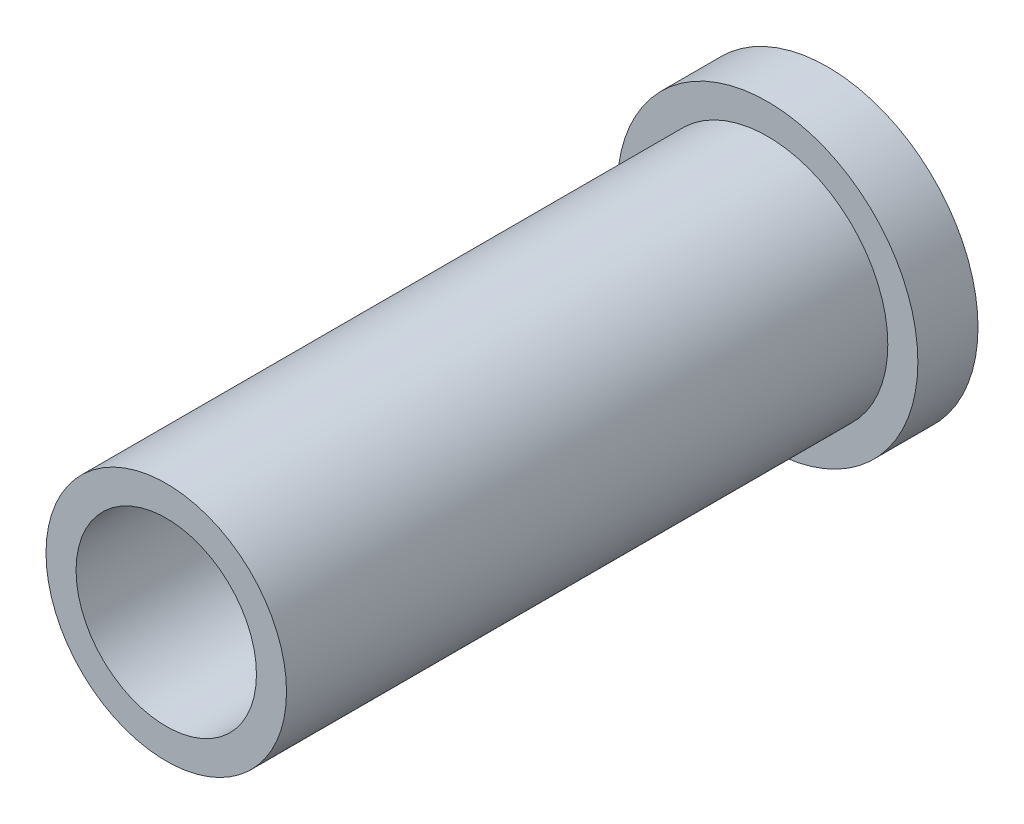
ISO-10303-21;
HEADER;
FILE_DESCRIPTION(('STEP AP214'),'2;1');
FILE_NAME('part.step','',(''),(''),'','','');
FILE_SCHEMA(('AUTOMOTIVE_DESIGN { 1 0 10303 214 1 1 1 1 }'));
ENDSEC;
DATA;
#1=APPLICATION_CONTEXT('core data for automotive mechanical design processes');
#2=APPLICATION_PROTOCOL_DEFINITION('international standard','automotive_design',2000,#1);
#3=PRODUCT_CONTEXT('',#1,'mechanical');
#4=PRODUCT('Part','Part','',(#3));
#5=PRODUCT_RELATED_PRODUCT_CATEGORY('part','',(#4));
#6=PRODUCT_DEFINITION_FORMATION('','',#4);
#7=PRODUCT_DEFINITION_CONTEXT('part definition',#1,'design');
#8=PRODUCT_DEFINITION('design','',#6,#7);
#9=PRODUCT_DEFINITION_SHAPE('','',#8);
#10=(LENGTH_UNIT() NAMED_UNIT(*) SI_UNIT(.MILLI.,.METRE.));
#11=(NAMED_UNIT(*) PLANE_ANGLE_UNIT() SI_UNIT($,.RADIAN.));
#12=(NAMED_UNIT(*) SI_UNIT($,.STERADIAN.) SOLID_ANGLE_UNIT());
#13=UNCERTAINTY_MEASURE_WITH_UNIT(LENGTH_MEASURE(1.E-05),#10,'distance_accuracy_value','');
#14=(GEOMETRIC_REPRESENTATION_CONTEXT(3) GLOBAL_UNCERTAINTY_ASSIGNED_CONTEXT((#13)) GLOBAL_UNIT_ASSIGNED_CONTEXT((#10,
#11,#12)) REPRESENTATION_CONTEXT('',''));
#15=CARTESIAN_POINT('',(0.,0.,0.));
#16=DIRECTION('',(0.,0.,1.));
#17=DIRECTION('',(1.,0.,0.));
#18=AXIS2_PLACEMENT_3D('',#15,#16,#17);
#19=CARTESIAN_POINT('',(0.,0.,3.));
#20=DIRECTION('',(0.,0.,-1.));
#21=DIRECTION('',(-1.,0.,0.));
#22=AXIS2_PLACEMENT_3D('',#19,#20,#21);
#23=CYLINDRICAL_SURFACE('',#22,7.5);
#24=CARTESIAN_POINT('',(0.,0.,3.));
#25=DIRECTION('',(0.,0.,1.));
#26=DIRECTION('',(1.,0.,0.));
#27=AXIS2_PLACEMENT_3D('',#24,#25,#26);
#28=CIRCLE('',#27,7.5);
#29=CARTESIAN_POINT('',(7.5,0.,3.));
#30=VERTEX_POINT('',#29);
#31=EDGE_CURVE('E37',#30,#30,#28,.T.);
#32=ORIENTED_EDGE('',*,*,#31,.F.);
#33=EDGE_LOOP('',(#32));
#34=FACE_BOUND('',#33,.T.);
#35=CARTESIAN_POINT('',(0.,0.,0.));
#36=DIRECTION('',(0.,0.,1.));
#37=DIRECTION('',(1.,0.,0.));
#38=AXIS2_PLACEMENT_3D('',#35,#36,#37);
#39=CIRCLE('',#38,7.5);
#40=CARTESIAN_POINT('',(7.5,0.,0.));
#41=VERTEX_POINT('',#40);
#42=EDGE_CURVE('E41',#41,#41,#39,.T.);
#43=ORIENTED_EDGE('',*,*,#42,.T.);
#44=EDGE_LOOP('',(#43));
#45=FACE_BOUND('',#44,.T.);
#46=ADVANCED_FACE('F31',(#34,#45),#23,.T.);
#47=CARTESIAN_POINT('',(0.,0.,3.));
#48=DIRECTION('',(0.,0.,1.));
#49=DIRECTION('',(1.,0.,0.));
#50=AXIS2_PLACEMENT_3D('',#47,#48,#49);
#51=PLANE('',#50);
#52=CARTESIAN_POINT('',(0.,0.,3.));
#53=DIRECTION('',(0.,0.,1.));
#54=DIRECTION('',(1.,0.,0.));
#55=AXIS2_PLACEMENT_3D('',#52,#53,#54);
#56=CIRCLE('',#55,6.);
#57=CARTESIAN_POINT('',(6.,0.,3.));
#58=VERTEX_POINT('',#57);
#59=EDGE_CURVE('E48',#58,#58,#56,.T.);
#60=ORIENTED_EDGE('',*,*,#59,.F.);
#61=EDGE_LOOP('',(#60));
#62=FACE_BOUND('',#61,.T.);
#63=ORIENTED_EDGE('',*,*,#31,.T.);
#64=EDGE_LOOP('',(#63));
#65=FACE_BOUND('',#64,.T.);
#66=ADVANCED_FACE('F71',(#62,#65),#51,.T.);
#67=CARTESIAN_POINT('',(0.,0.,0.));
#68=DIRECTION('',(0.,0.,1.));
#69=DIRECTION('',(1.,0.,0.));
#70=AXIS2_PLACEMENT_3D('',#67,#68,#69);
#71=PLANE('',#70);
#72=ORIENTED_EDGE('',*,*,#42,.F.);
#73=EDGE_LOOP('',(#72));
#74=FACE_BOUND('',#73,.T.);
#75=ADVANCED_FACE('F62',(#74),#71,.F.);
#76=CARTESIAN_POINT('',(0.,0.,33.));
#77=DIRECTION('',(0.,0.,1.));
#78=DIRECTION('',(1.,0.,0.));
#79=AXIS2_PLACEMENT_3D('',#76,#77,#78);
#80=PLANE('',#79);
#81=CARTESIAN_POINT('',(0.,0.,33.));
#82=DIRECTION('',(0.,0.,1.));
#83=DIRECTION('',(1.,0.,0.));
#84=AXIS2_PLACEMENT_3D('',#81,#82,#83);
#85=CIRCLE('',#84,6.);
#86=CARTESIAN_POINT('',(6.,0.,33.));
#87=VERTEX_POINT('',#86);
#88=EDGE_CURVE('E46',#87,#87,#85,.T.);
#89=ORIENTED_EDGE('',*,*,#88,.T.);
#90=EDGE_LOOP('',(#89));
#91=FACE_BOUND('',#90,.T.);
#92=CARTESIAN_POINT('',(0.,0.,33.));
#93=DIRECTION('',(0.,0.,1.));
#94=DIRECTION('',(1.,0.,0.));
#95=AXIS2_PLACEMENT_3D('',#92,#93,#94);
#96=CIRCLE('',#95,4.5);
#97=CARTESIAN_POINT('',(4.5,0.,33.));
#98=VERTEX_POINT('',#97);
#99=EDGE_CURVE('E51',#98,#98,#96,.T.);
#100=ORIENTED_EDGE('',*,*,#99,.F.);
#101=EDGE_LOOP('',(#100));
#102=FACE_BOUND('',#101,.T.);
#103=ADVANCED_FACE('F59',(#91,#102),#80,.T.);
#104=CARTESIAN_POINT('',(0.,0.,33.));
#105=DIRECTION('',(0.,0.,-1.));
#106=DIRECTION('',(-1.,0.,0.));
#107=AXIS2_PLACEMENT_3D('',#104,#105,#106);
#108=CYLINDRICAL_SURFACE('',#107,6.);
#109=ORIENTED_EDGE('',*,*,#88,.F.);
#110=EDGE_LOOP('',(#109));
#111=FACE_BOUND('',#110,.T.);
#112=ORIENTED_EDGE('',*,*,#59,.T.);
#113=EDGE_LOOP('',(#112));
#114=FACE_BOUND('',#113,.T.);
#115=ADVANCED_FACE('F61',(#111,#114),#108,.T.);
#116=CARTESIAN_POINT('',(0.,0.,33.));
#117=DIRECTION('',(0.,0.,-1.));
#118=DIRECTION('',(-1.,0.,0.));
#119=AXIS2_PLACEMENT_3D('',#116,#117,#118);
#120=CYLINDRICAL_SURFACE('',#119,4.5);
#121=ORIENTED_EDGE('',*,*,#99,.T.);
#122=EDGE_LOOP('',(#121));
#123=FACE_BOUND('',#122,.T.);
#124=CARTESIAN_POINT('',(0.,0.,3.));
#125=DIRECTION('',(0.,0.,1.));
#126=DIRECTION('',(1.,0.,0.));
#127=AXIS2_PLACEMENT_3D('',#124,#125,#126);
#128=CIRCLE('',#127,4.5);
#129=CARTESIAN_POINT('',(4.5,0.,3.));
#130=VERTEX_POINT('',#129);
#131=EDGE_CURVE('E10',#130,#130,#128,.F.);
#132=ORIENTED_EDGE('',*,*,#131,.T.);
#133=EDGE_LOOP('',(#132));
#134=FACE_BOUND('',#133,.T.);
#135=ADVANCED_FACE('F57',(#123,#134),#120,.F.);
#136=ORIENTED_EDGE('',*,*,#131,.F.);
#137=EDGE_LOOP('',(#136));
#138=FACE_BOUND('',#137,.T.);
#139=ADVANCED_FACE('F81',(#138),#51,.T.);
#140=CLOSED_SHELL('',(#46,#66,#75,#103,#115,#135,#139));
#141=MANIFOLD_SOLID_BREP('B2',#140);
#142=ADVANCED_BREP_SHAPE_REPRESENTATION('',(#18,#141),#14);
#143=SHAPE_DEFINITION_REPRESENTATION(#9,#142);
ENDSEC;
END-ISO-10303-21;
